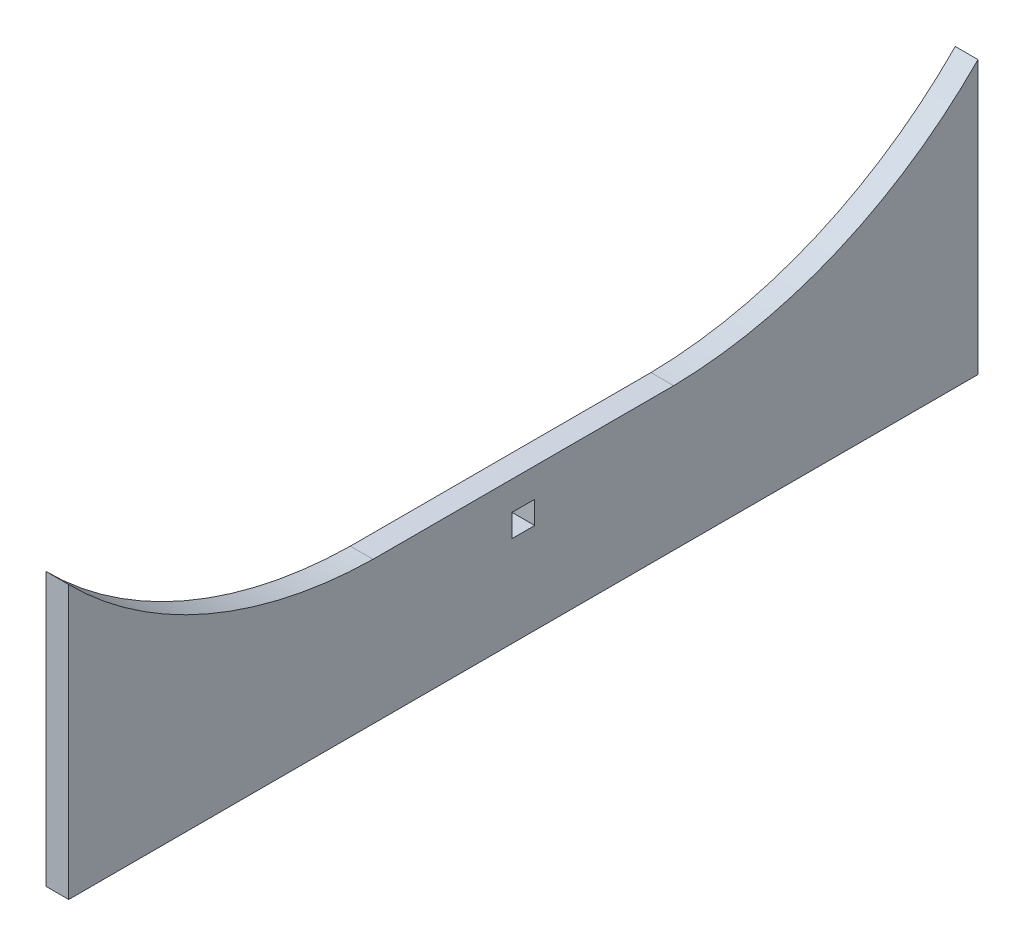
ISO-10303-21;
HEADER;
FILE_DESCRIPTION(('STEP AP214'),'2;1');
FILE_NAME('part.step','',(''),(''),'','','');
FILE_SCHEMA(('AUTOMOTIVE_DESIGN { 1 0 10303 214 1 1 1 1 }'));
ENDSEC;
DATA;
#1=APPLICATION_CONTEXT('core data for automotive mechanical design processes');
#2=APPLICATION_PROTOCOL_DEFINITION('international standard','automotive_design',2000,#1);
#3=PRODUCT_CONTEXT('',#1,'mechanical');
#4=PRODUCT('Part','Part','',(#3));
#5=PRODUCT_RELATED_PRODUCT_CATEGORY('part','',(#4));
#6=PRODUCT_DEFINITION_FORMATION('','',#4);
#7=PRODUCT_DEFINITION_CONTEXT('part definition',#1,'design');
#8=PRODUCT_DEFINITION('design','',#6,#7);
#9=PRODUCT_DEFINITION_SHAPE('','',#8);
#10=(LENGTH_UNIT() NAMED_UNIT(*) SI_UNIT(.MILLI.,.METRE.));
#11=(NAMED_UNIT(*) PLANE_ANGLE_UNIT() SI_UNIT($,.RADIAN.));
#12=(NAMED_UNIT(*) SI_UNIT($,.STERADIAN.) SOLID_ANGLE_UNIT());
#13=UNCERTAINTY_MEASURE_WITH_UNIT(LENGTH_MEASURE(1.E-05),#10,'distance_accuracy_value','');
#14=(GEOMETRIC_REPRESENTATION_CONTEXT(3) GLOBAL_UNCERTAINTY_ASSIGNED_CONTEXT((#13)) GLOBAL_UNIT_ASSIGNED_CONTEXT((#10,
#11,#12)) REPRESENTATION_CONTEXT('',''));
#15=CARTESIAN_POINT('',(0.,0.,0.));
#16=DIRECTION('',(0.,0.,1.));
#17=DIRECTION('',(1.,0.,0.));
#18=AXIS2_PLACEMENT_3D('',#15,#16,#17);
#19=CARTESIAN_POINT('',(6.35,123.903959807467,39.9782376653924));
#20=DIRECTION('',(1.,0.,0.));
#21=DIRECTION('',(0.,0.,-1.));
#22=AXIS2_PLACEMENT_3D('',#19,#20,#21);
#23=PLANE('',#22);
#24=DIRECTION('',(0.,1.,0.));
#25=VECTOR('',#24,1.);
#26=CARTESIAN_POINT('',(6.35,38.1,-127.));
#27=LINE('',#26,#25);
#28=CARTESIAN_POINT('',(6.35,-38.1,-127.));
#29=VERTEX_POINT('',#28);
#30=CARTESIAN_POINT('',(6.35,38.1,-127.));
#31=VERTEX_POINT('',#30);
#32=EDGE_CURVE('E147',#29,#31,#27,.T.);
#33=ORIENTED_EDGE('',*,*,#32,.T.);
#34=CARTESIAN_POINT('',(6.35,123.90395981122,-39.9782376637854));
#35=DIRECTION('',(-1.,0.,0.));
#36=DIRECTION('',(0.,0.,1.));
#37=AXIS2_PLACEMENT_3D('',#34,#35,#36);
#38=CIRCLE('',#37,122.20927395);
#39=CARTESIAN_POINT('',(6.35,1.71141046208045,-42.));
#40=VERTEX_POINT('',#39);
#41=EDGE_CURVE('E150',#31,#40,#38,.T.);
#42=ORIENTED_EDGE('',*,*,#41,.T.);
#43=DIRECTION('',(0.,0.,1.));
#44=VECTOR('',#43,1.);
#45=CARTESIAN_POINT('',(6.35,1.71141046208045,42.));
#46=LINE('',#45,#44);
#47=CARTESIAN_POINT('',(6.35,1.71141046208045,42.));
#48=VERTEX_POINT('',#47);
#49=EDGE_CURVE('E153',#40,#48,#46,.T.);
#50=ORIENTED_EDGE('',*,*,#49,.T.);
#51=CARTESIAN_POINT('',(6.35,123.903959807467,39.9782376653924));
#52=DIRECTION('',(-1.,0.,0.));
#53=DIRECTION('',(0.,0.,-1.));
#54=AXIS2_PLACEMENT_3D('',#51,#52,#53);
#55=CIRCLE('',#54,122.20927394622);
#56=CARTESIAN_POINT('',(6.35,38.1,127.));
#57=VERTEX_POINT('',#56);
#58=EDGE_CURVE('E155',#48,#57,#55,.T.);
#59=ORIENTED_EDGE('',*,*,#58,.T.);
#60=DIRECTION('',(0.,-1.,0.));
#61=VECTOR('',#60,1.);
#62=CARTESIAN_POINT('',(6.35,38.1,127.));
#63=LINE('',#62,#61);
#64=CARTESIAN_POINT('',(6.35,-38.1,127.));
#65=VERTEX_POINT('',#64);
#66=EDGE_CURVE('E157',#57,#65,#63,.T.);
#67=ORIENTED_EDGE('',*,*,#66,.T.);
#68=DIRECTION('',(0.,0.,-1.));
#69=VECTOR('',#68,1.);
#70=CARTESIAN_POINT('',(6.35,-38.1,127.));
#71=LINE('',#70,#69);
#72=EDGE_CURVE('E159',#65,#29,#71,.T.);
#73=ORIENTED_EDGE('',*,*,#72,.T.);
#74=EDGE_LOOP('',(#33,#42,#50,#59,#67,#73));
#75=FACE_BOUND('',#74,.T.);
#76=DIRECTION('',(0.,0.,1.));
#77=VECTOR('',#76,1.);
#78=CARTESIAN_POINT('',(6.35,-6.34999999999996,3.175));
#79=LINE('',#78,#77);
#80=CARTESIAN_POINT('',(6.35,-6.34999999999996,-3.175));
#81=VERTEX_POINT('',#80);
#82=CARTESIAN_POINT('',(6.35,-6.34999999999996,3.175));
#83=VERTEX_POINT('',#82);
#84=EDGE_CURVE('E119',#81,#83,#79,.T.);
#85=ORIENTED_EDGE('',*,*,#84,.F.);
#86=DIRECTION('',(0.,1.,0.));
#87=VECTOR('',#86,1.);
#88=CARTESIAN_POINT('',(6.35,-6.34999999999996,-3.175));
#89=LINE('',#88,#87);
#90=CARTESIAN_POINT('',(6.35,-12.7,-3.175));
#91=VERTEX_POINT('',#90);
#92=EDGE_CURVE('E111',#91,#81,#89,.T.);
#93=ORIENTED_EDGE('',*,*,#92,.F.);
#94=DIRECTION('',(0.,0.,-1.));
#95=VECTOR('',#94,1.);
#96=CARTESIAN_POINT('',(6.35,-12.7,3.175));
#97=LINE('',#96,#95);
#98=CARTESIAN_POINT('',(6.35,-12.7,3.175));
#99=VERTEX_POINT('',#98);
#100=EDGE_CURVE('E133',#99,#91,#97,.T.);
#101=ORIENTED_EDGE('',*,*,#100,.F.);
#102=DIRECTION('',(0.,-1.,0.));
#103=VECTOR('',#102,1.);
#104=CARTESIAN_POINT('',(6.35,-6.34999999999996,3.175));
#105=LINE('',#104,#103);
#106=EDGE_CURVE('E131',#83,#99,#105,.T.);
#107=ORIENTED_EDGE('',*,*,#106,.F.);
#108=EDGE_LOOP('',(#85,#93,#101,#107));
#109=FACE_BOUND('',#108,.T.);
#110=ADVANCED_FACE('F34',(#75,#109),#23,.T.);
#111=CARTESIAN_POINT('',(0.,123.903959807467,39.9782376653924));
#112=DIRECTION('',(1.,0.,0.));
#113=DIRECTION('',(0.,0.,-1.));
#114=AXIS2_PLACEMENT_3D('',#111,#112,#113);
#115=PLANE('',#114);
#116=DIRECTION('',(0.,1.,0.));
#117=VECTOR('',#116,1.);
#118=CARTESIAN_POINT('',(0.,38.1,-127.));
#119=LINE('',#118,#117);
#120=CARTESIAN_POINT('',(0.,-38.1,-127.));
#121=VERTEX_POINT('',#120);
#122=CARTESIAN_POINT('',(0.,38.1,-127.));
#123=VERTEX_POINT('',#122);
#124=EDGE_CURVE('E127',#121,#123,#119,.T.);
#125=ORIENTED_EDGE('',*,*,#124,.F.);
#126=DIRECTION('',(0.,0.,-1.));
#127=VECTOR('',#126,1.);
#128=CARTESIAN_POINT('',(0.,-38.1,127.));
#129=LINE('',#128,#127);
#130=CARTESIAN_POINT('',(0.,-38.1,127.));
#131=VERTEX_POINT('',#130);
#132=EDGE_CURVE('E151',#131,#121,#129,.T.);
#133=ORIENTED_EDGE('',*,*,#132,.F.);
#134=DIRECTION('',(0.,-1.,0.));
#135=VECTOR('',#134,1.);
#136=CARTESIAN_POINT('',(0.,38.1,127.));
#137=LINE('',#136,#135);
#138=CARTESIAN_POINT('',(0.,38.1,127.));
#139=VERTEX_POINT('',#138);
#140=EDGE_CURVE('E170',#139,#131,#137,.T.);
#141=ORIENTED_EDGE('',*,*,#140,.F.);
#142=CARTESIAN_POINT('',(0.,123.903959807467,39.9782376653924));
#143=DIRECTION('',(-1.,0.,0.));
#144=DIRECTION('',(0.,0.,-1.));
#145=AXIS2_PLACEMENT_3D('',#142,#143,#144);
#146=CIRCLE('',#145,122.20927394622);
#147=CARTESIAN_POINT('',(0.,1.71141046208045,42.));
#148=VERTEX_POINT('',#147);
#149=EDGE_CURVE('E168',#148,#139,#146,.T.);
#150=ORIENTED_EDGE('',*,*,#149,.F.);
#151=DIRECTION('',(0.,0.,1.));
#152=VECTOR('',#151,1.);
#153=CARTESIAN_POINT('',(0.,1.71141046208045,42.));
#154=LINE('',#153,#152);
#155=CARTESIAN_POINT('',(0.,1.71141046208045,-42.));
#156=VERTEX_POINT('',#155);
#157=EDGE_CURVE('E166',#156,#148,#154,.T.);
#158=ORIENTED_EDGE('',*,*,#157,.F.);
#159=CARTESIAN_POINT('',(0.,123.90395981122,-39.9782376637854));
#160=DIRECTION('',(-1.,0.,0.));
#161=DIRECTION('',(0.,0.,1.));
#162=AXIS2_PLACEMENT_3D('',#159,#160,#161);
#163=CIRCLE('',#162,122.20927395);
#164=EDGE_CURVE('E164',#123,#156,#163,.T.);
#165=ORIENTED_EDGE('',*,*,#164,.F.);
#166=EDGE_LOOP('',(#125,#133,#141,#150,#158,#165));
#167=FACE_BOUND('',#166,.T.);
#168=DIRECTION('',(0.,1.,0.));
#169=VECTOR('',#168,1.);
#170=CARTESIAN_POINT('',(0.,-6.34999999999996,-3.175));
#171=LINE('',#170,#169);
#172=CARTESIAN_POINT('',(0.,-12.7,-3.175));
#173=VERTEX_POINT('',#172);
#174=CARTESIAN_POINT('',(0.,-6.34999999999996,-3.175));
#175=VERTEX_POINT('',#174);
#176=EDGE_CURVE('E57',#173,#175,#171,.T.);
#177=ORIENTED_EDGE('',*,*,#176,.T.);
#178=DIRECTION('',(0.,0.,1.));
#179=VECTOR('',#178,1.);
#180=CARTESIAN_POINT('',(0.,-6.34999999999996,3.175));
#181=LINE('',#180,#179);
#182=CARTESIAN_POINT('',(0.,-6.34999999999996,3.175));
#183=VERTEX_POINT('',#182);
#184=EDGE_CURVE('E126',#175,#183,#181,.T.);
#185=ORIENTED_EDGE('',*,*,#184,.T.);
#186=DIRECTION('',(0.,-1.,0.));
#187=VECTOR('',#186,1.);
#188=CARTESIAN_POINT('',(0.,-6.34999999999996,3.175));
#189=LINE('',#188,#187);
#190=CARTESIAN_POINT('',(0.,-12.7,3.175));
#191=VERTEX_POINT('',#190);
#192=EDGE_CURVE('E139',#183,#191,#189,.T.);
#193=ORIENTED_EDGE('',*,*,#192,.T.);
#194=DIRECTION('',(0.,0.,-1.));
#195=VECTOR('',#194,1.);
#196=CARTESIAN_POINT('',(0.,-12.7,3.175));
#197=LINE('',#196,#195);
#198=EDGE_CURVE('E120',#191,#173,#197,.T.);
#199=ORIENTED_EDGE('',*,*,#198,.T.);
#200=EDGE_LOOP('',(#177,#185,#193,#199));
#201=FACE_BOUND('',#200,.T.);
#202=ADVANCED_FACE('F194',(#167,#201),#115,.F.);
#203=CARTESIAN_POINT('',(6.35,38.1,-127.));
#204=DIRECTION('',(0.,0.,1.));
#205=DIRECTION('',(1.,0.,0.));
#206=AXIS2_PLACEMENT_3D('',#203,#204,#205);
#207=PLANE('',#206);
#208=ORIENTED_EDGE('',*,*,#124,.T.);
#209=DIRECTION('',(-1.,0.,0.));
#210=VECTOR('',#209,1.);
#211=CARTESIAN_POINT('',(6.35,38.1,-127.));
#212=LINE('',#211,#210);
#213=EDGE_CURVE('E11',#31,#123,#212,.T.);
#214=ORIENTED_EDGE('',*,*,#213,.F.);
#215=ORIENTED_EDGE('',*,*,#32,.F.);
#216=DIRECTION('',(-1.,0.,0.));
#217=VECTOR('',#216,1.);
#218=CARTESIAN_POINT('',(6.35,-38.1,-127.));
#219=LINE('',#218,#217);
#220=EDGE_CURVE('E161',#29,#121,#219,.T.);
#221=ORIENTED_EDGE('',*,*,#220,.T.);
#222=EDGE_LOOP('',(#208,#214,#215,#221));
#223=FACE_BOUND('',#222,.T.);
#224=ADVANCED_FACE('F36',(#223),#207,.F.);
#225=CARTESIAN_POINT('',(6.35,123.90395981122,-39.9782376637854));
#226=DIRECTION('',(-1.,0.,0.));
#227=DIRECTION('',(0.,0.,1.));
#228=AXIS2_PLACEMENT_3D('',#225,#226,#227);
#229=CYLINDRICAL_SURFACE('',#228,122.20927395);
#230=ORIENTED_EDGE('',*,*,#164,.T.);
#231=DIRECTION('',(-1.,0.,0.));
#232=VECTOR('',#231,1.);
#233=CARTESIAN_POINT('',(6.35,1.71141046208045,-42.));
#234=LINE('',#233,#232);
#235=EDGE_CURVE('E42',#40,#156,#234,.T.);
#236=ORIENTED_EDGE('',*,*,#235,.F.);
#237=ORIENTED_EDGE('',*,*,#41,.F.);
#238=ORIENTED_EDGE('',*,*,#213,.T.);
#239=EDGE_LOOP('',(#230,#236,#237,#238));
#240=FACE_BOUND('',#239,.T.);
#241=ADVANCED_FACE('F211',(#240),#229,.F.);
#242=CARTESIAN_POINT('',(6.35,1.71141046208045,42.));
#243=DIRECTION('',(0.,-1.,0.));
#244=DIRECTION('',(0.,0.,-1.));
#245=AXIS2_PLACEMENT_3D('',#242,#243,#244);
#246=PLANE('',#245);
#247=ORIENTED_EDGE('',*,*,#157,.T.);
#248=DIRECTION('',(-1.,0.,0.));
#249=VECTOR('',#248,1.);
#250=CARTESIAN_POINT('',(6.35,1.71141046208045,42.));
#251=LINE('',#250,#249);
#252=EDGE_CURVE('E181',#48,#148,#251,.T.);
#253=ORIENTED_EDGE('',*,*,#252,.F.);
#254=ORIENTED_EDGE('',*,*,#49,.F.);
#255=ORIENTED_EDGE('',*,*,#235,.T.);
#256=EDGE_LOOP('',(#247,#253,#254,#255));
#257=FACE_BOUND('',#256,.T.);
#258=ADVANCED_FACE('F188',(#257),#246,.F.);
#259=CARTESIAN_POINT('',(6.35,123.903959807467,39.9782376653924));
#260=DIRECTION('',(-1.,0.,0.));
#261=DIRECTION('',(0.,0.,1.));
#262=AXIS2_PLACEMENT_3D('',#259,#260,#261);
#263=CYLINDRICAL_SURFACE('',#262,122.20927394622);
#264=ORIENTED_EDGE('',*,*,#149,.T.);
#265=DIRECTION('',(-1.,0.,0.));
#266=VECTOR('',#265,1.);
#267=CARTESIAN_POINT('',(6.35,38.1,127.));
#268=LINE('',#267,#266);
#269=EDGE_CURVE('E178',#57,#139,#268,.T.);
#270=ORIENTED_EDGE('',*,*,#269,.F.);
#271=ORIENTED_EDGE('',*,*,#58,.F.);
#272=ORIENTED_EDGE('',*,*,#252,.T.);
#273=EDGE_LOOP('',(#264,#270,#271,#272));
#274=FACE_BOUND('',#273,.T.);
#275=ADVANCED_FACE('F200',(#274),#263,.F.);
#276=CARTESIAN_POINT('',(6.35,38.1,127.));
#277=DIRECTION('',(0.,0.,-1.));
#278=DIRECTION('',(-1.,0.,0.));
#279=AXIS2_PLACEMENT_3D('',#276,#277,#278);
#280=PLANE('',#279);
#281=ORIENTED_EDGE('',*,*,#140,.T.);
#282=DIRECTION('',(-1.,0.,0.));
#283=VECTOR('',#282,1.);
#284=CARTESIAN_POINT('',(6.35,-38.1,127.));
#285=LINE('',#284,#283);
#286=EDGE_CURVE('E175',#65,#131,#285,.T.);
#287=ORIENTED_EDGE('',*,*,#286,.F.);
#288=ORIENTED_EDGE('',*,*,#66,.F.);
#289=ORIENTED_EDGE('',*,*,#269,.T.);
#290=EDGE_LOOP('',(#281,#287,#288,#289));
#291=FACE_BOUND('',#290,.T.);
#292=ADVANCED_FACE('F204',(#291),#280,.F.);
#293=CARTESIAN_POINT('',(6.35,-38.1,127.));
#294=DIRECTION('',(0.,1.,0.));
#295=DIRECTION('',(0.,0.,1.));
#296=AXIS2_PLACEMENT_3D('',#293,#294,#295);
#297=PLANE('',#296);
#298=ORIENTED_EDGE('',*,*,#132,.T.);
#299=ORIENTED_EDGE('',*,*,#220,.F.);
#300=ORIENTED_EDGE('',*,*,#72,.F.);
#301=ORIENTED_EDGE('',*,*,#286,.T.);
#302=EDGE_LOOP('',(#298,#299,#300,#301));
#303=FACE_BOUND('',#302,.T.);
#304=ADVANCED_FACE('F214',(#303),#297,.F.);
#305=CARTESIAN_POINT('',(6.35,-6.34999999999996,-3.175));
#306=DIRECTION('',(0.,0.,1.));
#307=DIRECTION('',(0.,-1.,0.));
#308=AXIS2_PLACEMENT_3D('',#305,#306,#307);
#309=PLANE('',#308);
#310=ORIENTED_EDGE('',*,*,#176,.F.);
#311=DIRECTION('',(-1.,0.,0.));
#312=VECTOR('',#311,1.);
#313=CARTESIAN_POINT('',(6.35,-12.7,-3.175));
#314=LINE('',#313,#312);
#315=EDGE_CURVE('E115',#91,#173,#314,.T.);
#316=ORIENTED_EDGE('',*,*,#315,.F.);
#317=ORIENTED_EDGE('',*,*,#92,.T.);
#318=DIRECTION('',(-1.,0.,0.));
#319=VECTOR('',#318,1.);
#320=CARTESIAN_POINT('',(6.35,-6.34999999999996,-3.175));
#321=LINE('',#320,#319);
#322=EDGE_CURVE('E114',#81,#175,#321,.T.);
#323=ORIENTED_EDGE('',*,*,#322,.T.);
#324=EDGE_LOOP('',(#310,#316,#317,#323));
#325=FACE_BOUND('',#324,.T.);
#326=ADVANCED_FACE('F113',(#325),#309,.T.);
#327=CARTESIAN_POINT('',(6.35,-6.34999999999996,3.175));
#328=DIRECTION('',(0.,-1.,0.));
#329=DIRECTION('',(0.,0.,-1.));
#330=AXIS2_PLACEMENT_3D('',#327,#328,#329);
#331=PLANE('',#330);
#332=ORIENTED_EDGE('',*,*,#184,.F.);
#333=ORIENTED_EDGE('',*,*,#322,.F.);
#334=ORIENTED_EDGE('',*,*,#84,.T.);
#335=DIRECTION('',(-1.,0.,0.));
#336=VECTOR('',#335,1.);
#337=CARTESIAN_POINT('',(6.35,-6.34999999999996,3.175));
#338=LINE('',#337,#336);
#339=EDGE_CURVE('E128',#83,#183,#338,.T.);
#340=ORIENTED_EDGE('',*,*,#339,.T.);
#341=EDGE_LOOP('',(#332,#333,#334,#340));
#342=FACE_BOUND('',#341,.T.);
#343=ADVANCED_FACE('F123',(#342),#331,.T.);
#344=CARTESIAN_POINT('',(6.35,-6.34999999999996,3.175));
#345=DIRECTION('',(0.,0.,-1.));
#346=DIRECTION('',(0.,1.,0.));
#347=AXIS2_PLACEMENT_3D('',#344,#345,#346);
#348=PLANE('',#347);
#349=ORIENTED_EDGE('',*,*,#192,.F.);
#350=ORIENTED_EDGE('',*,*,#339,.F.);
#351=ORIENTED_EDGE('',*,*,#106,.T.);
#352=DIRECTION('',(-1.,0.,0.));
#353=VECTOR('',#352,1.);
#354=CARTESIAN_POINT('',(6.35,-12.7,3.175));
#355=LINE('',#354,#353);
#356=EDGE_CURVE('E49',#99,#191,#355,.T.);
#357=ORIENTED_EDGE('',*,*,#356,.T.);
#358=EDGE_LOOP('',(#349,#350,#351,#357));
#359=FACE_BOUND('',#358,.T.);
#360=ADVANCED_FACE('F232',(#359),#348,.T.);
#361=CARTESIAN_POINT('',(6.35,-12.7,3.175));
#362=DIRECTION('',(0.,1.,0.));
#363=DIRECTION('',(0.,0.,1.));
#364=AXIS2_PLACEMENT_3D('',#361,#362,#363);
#365=PLANE('',#364);
#366=ORIENTED_EDGE('',*,*,#198,.F.);
#367=ORIENTED_EDGE('',*,*,#356,.F.);
#368=ORIENTED_EDGE('',*,*,#100,.T.);
#369=ORIENTED_EDGE('',*,*,#315,.T.);
#370=EDGE_LOOP('',(#366,#367,#368,#369));
#371=FACE_BOUND('',#370,.T.);
#372=ADVANCED_FACE('F235',(#371),#365,.T.);
#373=CLOSED_SHELL('',(#110,#202,#224,#241,#258,#275,#292,#304,#326,#343,#360,#372));
#374=MANIFOLD_SOLID_BREP('B2',#373);
#375=ADVANCED_BREP_SHAPE_REPRESENTATION('',(#18,#374),#14);
#376=SHAPE_DEFINITION_REPRESENTATION(#9,#375);
ENDSEC;
END-ISO-10303-21;
